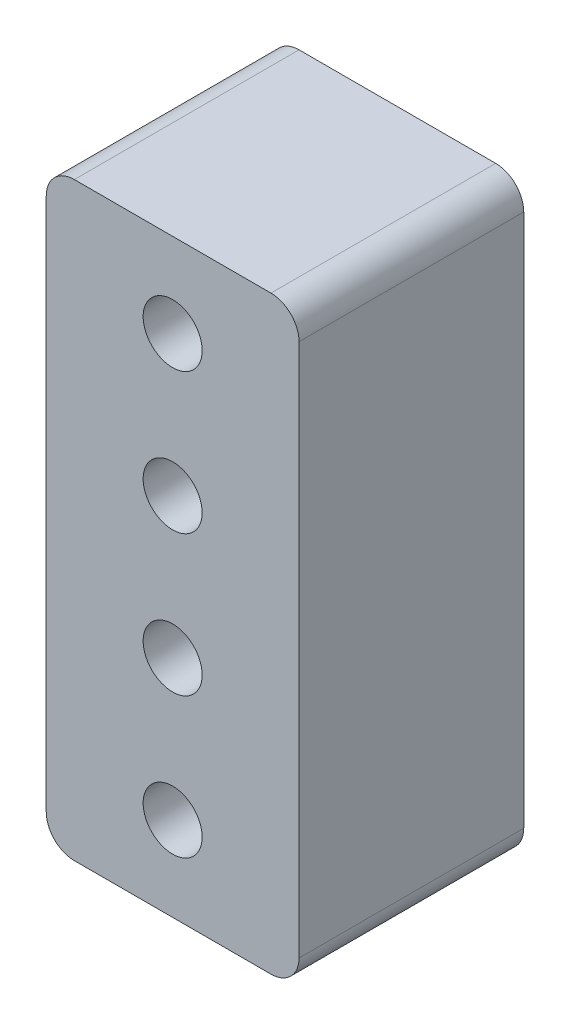
ISO-10303-21;
HEADER;
FILE_DESCRIPTION(('STEP AP214'),'2;1');
FILE_NAME('part.step','',(''),(''),'','','');
FILE_SCHEMA(('AUTOMOTIVE_DESIGN { 1 0 10303 214 1 1 1 1 }'));
ENDSEC;
DATA;
#1=APPLICATION_CONTEXT('core data for automotive mechanical design processes');
#2=APPLICATION_PROTOCOL_DEFINITION('international standard','automotive_design',2000,#1);
#3=PRODUCT_CONTEXT('',#1,'mechanical');
#4=PRODUCT('Part','Part','',(#3));
#5=PRODUCT_RELATED_PRODUCT_CATEGORY('part','',(#4));
#6=PRODUCT_DEFINITION_FORMATION('','',#4);
#7=PRODUCT_DEFINITION_CONTEXT('part definition',#1,'design');
#8=PRODUCT_DEFINITION('design','',#6,#7);
#9=PRODUCT_DEFINITION_SHAPE('','',#8);
#10=(LENGTH_UNIT() NAMED_UNIT(*) SI_UNIT(.MILLI.,.METRE.));
#11=(NAMED_UNIT(*) PLANE_ANGLE_UNIT() SI_UNIT($,.RADIAN.));
#12=(NAMED_UNIT(*) SI_UNIT($,.STERADIAN.) SOLID_ANGLE_UNIT());
#13=UNCERTAINTY_MEASURE_WITH_UNIT(LENGTH_MEASURE(1.E-05),#10,'distance_accuracy_value','');
#14=(GEOMETRIC_REPRESENTATION_CONTEXT(3) GLOBAL_UNCERTAINTY_ASSIGNED_CONTEXT((#13)) GLOBAL_UNIT_ASSIGNED_CONTEXT((#10,
#11,#12)) REPRESENTATION_CONTEXT('',''));
#15=CARTESIAN_POINT('',(0.,0.,0.));
#16=DIRECTION('',(0.,0.,1.));
#17=DIRECTION('',(1.,0.,0.));
#18=AXIS2_PLACEMENT_3D('',#15,#16,#17);
#19=CARTESIAN_POINT('',(22.5,15.,7.5));
#20=DIRECTION('',(0.,0.,1.));
#21=DIRECTION('',(1.,0.,0.));
#22=AXIS2_PLACEMENT_3D('',#19,#20,#21);
#23=CONICAL_SURFACE('',#22,2.5,0.18131977440149);
#24=CARTESIAN_POINT('',(22.5,15.,7.49999999999998));
#25=DIRECTION('',(0.,0.,-1.));
#26=DIRECTION('',(-1.,0.,0.));
#27=AXIS2_PLACEMENT_3D('',#24,#25,#26);
#28=CIRCLE('',#27,2.5);
#29=CARTESIAN_POINT('',(20.,15.,7.49999999999998));
#30=VERTEX_POINT('',#29);
#31=EDGE_CURVE('E301',#30,#30,#28,.F.);
#32=ORIENTED_EDGE('',*,*,#31,.F.);
#33=EDGE_LOOP('',(#32));
#34=FACE_BOUND('',#33,.T.);
#35=CARTESIAN_POINT('',(22.5,15.,22.5));
#36=DIRECTION('',(0.,0.,1.));
#37=DIRECTION('',(1.,0.,0.));
#38=AXIS2_PLACEMENT_3D('',#35,#36,#37);
#39=CIRCLE('',#38,5.25);
#40=CARTESIAN_POINT('',(27.75,15.,22.5));
#41=VERTEX_POINT('',#40);
#42=EDGE_CURVE('E238',#41,#41,#39,.T.);
#43=ORIENTED_EDGE('',*,*,#42,.T.);
#44=EDGE_LOOP('',(#43));
#45=FACE_BOUND('',#44,.T.);
#46=ADVANCED_FACE('F36',(#34,#45),#23,.F.);
#47=CARTESIAN_POINT('',(22.5,15.,7.5));
#48=DIRECTION('',(0.,-1.,0.));
#49=DIRECTION('',(-1.,0.,0.));
#50=AXIS2_PLACEMENT_3D('',#47,#48,#49);
#51=SPHERICAL_SURFACE('',#50,2.5);
#52=CARTESIAN_POINT('',(22.5,15.,7.5));
#53=DIRECTION('',(0.,0.,-1.));
#54=DIRECTION('',(-1.,0.,0.));
#55=AXIS2_PLACEMENT_3D('',#52,#53,#54);
#56=SPHERICAL_SURFACE('',#55,2.5);
#57=ORIENTED_EDGE('',*,*,#31,.T.);
#58=EDGE_LOOP('',(#57));
#59=FACE_BOUND('',#58,.T.);
#60=ADVANCED_FACE('F220',(#59),#56,.F.);
#61=CARTESIAN_POINT('',(22.5,15.,22.5));
#62=DIRECTION('',(0.,0.,1.));
#63=DIRECTION('',(1.,0.,0.));
#64=AXIS2_PLACEMENT_3D('',#61,#62,#63);
#65=CYLINDRICAL_SURFACE('',#64,5.25);
#66=ORIENTED_EDGE('',*,*,#42,.F.);
#67=EDGE_LOOP('',(#66));
#68=FACE_BOUND('',#67,.T.);
#69=CARTESIAN_POINT('',(22.5,15.,40.));
#70=DIRECTION('',(0.,0.,1.));
#71=DIRECTION('',(1.,0.,0.));
#72=AXIS2_PLACEMENT_3D('',#69,#70,#71);
#73=CIRCLE('',#72,5.25);
#74=CARTESIAN_POINT('',(27.75,15.,40.));
#75=VERTEX_POINT('',#74);
#76=EDGE_CURVE('E242',#75,#75,#73,.T.);
#77=ORIENTED_EDGE('',*,*,#76,.T.);
#78=EDGE_LOOP('',(#77));
#79=FACE_BOUND('',#78,.T.);
#80=ADVANCED_FACE('F215',(#68,#79),#65,.F.);
#81=CARTESIAN_POINT('',(22.5,40.,7.5));
#82=DIRECTION('',(0.,0.,1.));
#83=DIRECTION('',(1.,0.,0.));
#84=AXIS2_PLACEMENT_3D('',#81,#82,#83);
#85=CONICAL_SURFACE('',#84,2.5,0.18131977440149);
#86=CARTESIAN_POINT('',(22.5,40.,7.49999999999998));
#87=DIRECTION('',(0.,0.,-1.));
#88=DIRECTION('',(-1.,0.,0.));
#89=AXIS2_PLACEMENT_3D('',#86,#87,#88);
#90=CIRCLE('',#89,2.5);
#91=CARTESIAN_POINT('',(20.,40.,7.49999999999998));
#92=VERTEX_POINT('',#91);
#93=EDGE_CURVE('E306',#92,#92,#90,.F.);
#94=ORIENTED_EDGE('',*,*,#93,.F.);
#95=EDGE_LOOP('',(#94));
#96=FACE_BOUND('',#95,.T.);
#97=CARTESIAN_POINT('',(22.5,40.,22.5));
#98=DIRECTION('',(0.,0.,1.));
#99=DIRECTION('',(1.,0.,0.));
#100=AXIS2_PLACEMENT_3D('',#97,#98,#99);
#101=CIRCLE('',#100,5.25);
#102=CARTESIAN_POINT('',(27.75,40.,22.5));
#103=VERTEX_POINT('',#102);
#104=EDGE_CURVE('E200',#103,#103,#101,.T.);
#105=ORIENTED_EDGE('',*,*,#104,.T.);
#106=EDGE_LOOP('',(#105));
#107=FACE_BOUND('',#106,.T.);
#108=ADVANCED_FACE('F206',(#96,#107),#85,.F.);
#109=CARTESIAN_POINT('',(22.5,40.,7.5));
#110=DIRECTION('',(0.,-1.,0.));
#111=DIRECTION('',(-1.,0.,0.));
#112=AXIS2_PLACEMENT_3D('',#109,#110,#111);
#113=SPHERICAL_SURFACE('',#112,2.5);
#114=CARTESIAN_POINT('',(22.5,40.,7.5));
#115=DIRECTION('',(0.,0.,-1.));
#116=DIRECTION('',(-1.,0.,0.));
#117=AXIS2_PLACEMENT_3D('',#114,#115,#116);
#118=SPHERICAL_SURFACE('',#117,2.5);
#119=ORIENTED_EDGE('',*,*,#93,.T.);
#120=EDGE_LOOP('',(#119));
#121=FACE_BOUND('',#120,.T.);
#122=ADVANCED_FACE('F184',(#121),#118,.F.);
#123=CARTESIAN_POINT('',(22.5,40.,22.5));
#124=DIRECTION('',(0.,0.,1.));
#125=DIRECTION('',(1.,0.,0.));
#126=AXIS2_PLACEMENT_3D('',#123,#124,#125);
#127=CYLINDRICAL_SURFACE('',#126,5.25);
#128=ORIENTED_EDGE('',*,*,#104,.F.);
#129=EDGE_LOOP('',(#128));
#130=FACE_BOUND('',#129,.T.);
#131=CARTESIAN_POINT('',(22.5,40.,40.));
#132=DIRECTION('',(0.,0.,1.));
#133=DIRECTION('',(1.,0.,0.));
#134=AXIS2_PLACEMENT_3D('',#131,#132,#133);
#135=CIRCLE('',#134,5.25);
#136=CARTESIAN_POINT('',(27.75,40.,40.));
#137=VERTEX_POINT('',#136);
#138=EDGE_CURVE('E204',#137,#137,#135,.T.);
#139=ORIENTED_EDGE('',*,*,#138,.T.);
#140=EDGE_LOOP('',(#139));
#141=FACE_BOUND('',#140,.T.);
#142=ADVANCED_FACE('F179',(#130,#141),#127,.F.);
#143=CARTESIAN_POINT('',(0.,0.,40.));
#144=DIRECTION('',(1.,0.,0.));
#145=DIRECTION('',(0.,1.,0.));
#146=AXIS2_PLACEMENT_3D('',#143,#144,#145);
#147=PLANE('',#146);
#148=DIRECTION('',(0.,-1.,0.));
#149=VECTOR('',#148,1.);
#150=CARTESIAN_POINT('',(0.,0.,0.));
#151=LINE('',#150,#149);
#152=CARTESIAN_POINT('',(0.,100.,0.));
#153=VERTEX_POINT('',#152);
#154=CARTESIAN_POINT('',(0.,5.,0.));
#155=VERTEX_POINT('',#154);
#156=EDGE_CURVE('E133',#153,#155,#151,.T.);
#157=ORIENTED_EDGE('',*,*,#156,.T.);
#158=DIRECTION('',(0.,0.,-1.));
#159=VECTOR('',#158,1.);
#160=CARTESIAN_POINT('',(0.,5.,40.));
#161=LINE('',#160,#159);
#162=CARTESIAN_POINT('',(0.,5.,40.));
#163=VERTEX_POINT('',#162);
#164=EDGE_CURVE('E279',#155,#163,#161,.F.);
#165=ORIENTED_EDGE('',*,*,#164,.T.);
#166=DIRECTION('',(0.,-1.,0.));
#167=VECTOR('',#166,1.);
#168=CARTESIAN_POINT('',(0.,0.,40.));
#169=LINE('',#168,#167);
#170=CARTESIAN_POINT('',(0.,100.,40.));
#171=VERTEX_POINT('',#170);
#172=EDGE_CURVE('E131',#171,#163,#169,.T.);
#173=ORIENTED_EDGE('',*,*,#172,.F.);
#174=DIRECTION('',(0.,0.,-1.));
#175=VECTOR('',#174,1.);
#176=CARTESIAN_POINT('',(0.,100.,40.));
#177=LINE('',#176,#175);
#178=EDGE_CURVE('E276',#171,#153,#177,.T.);
#179=ORIENTED_EDGE('',*,*,#178,.T.);
#180=EDGE_LOOP('',(#157,#165,#173,#179));
#181=FACE_BOUND('',#180,.T.);
#182=ADVANCED_FACE('F175',(#181),#147,.F.);
#183=CARTESIAN_POINT('',(0.,0.,40.));
#184=DIRECTION('',(0.,1.,0.));
#185=DIRECTION('',(0.,0.,1.));
#186=AXIS2_PLACEMENT_3D('',#183,#184,#185);
#187=PLANE('',#186);
#188=DIRECTION('',(1.,0.,0.));
#189=VECTOR('',#188,1.);
#190=CARTESIAN_POINT('',(0.,0.,0.));
#191=LINE('',#190,#189);
#192=CARTESIAN_POINT('',(5.,0.,0.));
#193=VERTEX_POINT('',#192);
#194=CARTESIAN_POINT('',(40.,0.,0.));
#195=VERTEX_POINT('',#194);
#196=EDGE_CURVE('E129',#193,#195,#191,.T.);
#197=ORIENTED_EDGE('',*,*,#196,.T.);
#198=DIRECTION('',(0.,0.,-1.));
#199=VECTOR('',#198,1.);
#200=CARTESIAN_POINT('',(40.,0.,40.));
#201=LINE('',#200,#199);
#202=CARTESIAN_POINT('',(40.,0.,40.));
#203=VERTEX_POINT('',#202);
#204=EDGE_CURVE('E107',#195,#203,#201,.F.);
#205=ORIENTED_EDGE('',*,*,#204,.T.);
#206=DIRECTION('',(1.,0.,0.));
#207=VECTOR('',#206,1.);
#208=CARTESIAN_POINT('',(0.,0.,40.));
#209=LINE('',#208,#207);
#210=CARTESIAN_POINT('',(5.,0.,40.));
#211=VERTEX_POINT('',#210);
#212=EDGE_CURVE('E291',#211,#203,#209,.T.);
#213=ORIENTED_EDGE('',*,*,#212,.F.);
#214=DIRECTION('',(0.,0.,-1.));
#215=VECTOR('',#214,1.);
#216=CARTESIAN_POINT('',(5.,0.,40.));
#217=LINE('',#216,#215);
#218=EDGE_CURVE('E112',#211,#193,#217,.T.);
#219=ORIENTED_EDGE('',*,*,#218,.T.);
#220=EDGE_LOOP('',(#197,#205,#213,#219));
#221=FACE_BOUND('',#220,.T.);
#222=ADVANCED_FACE('F172',(#221),#187,.F.);
#223=CARTESIAN_POINT('',(45.,0.,40.));
#224=DIRECTION('',(-1.,0.,0.));
#225=DIRECTION('',(0.,-1.,0.));
#226=AXIS2_PLACEMENT_3D('',#223,#224,#225);
#227=PLANE('',#226);
#228=DIRECTION('',(0.,1.,0.));
#229=VECTOR('',#228,1.);
#230=CARTESIAN_POINT('',(45.,0.,40.));
#231=LINE('',#230,#229);
#232=CARTESIAN_POINT('',(45.,5.,40.));
#233=VERTEX_POINT('',#232);
#234=CARTESIAN_POINT('',(45.,100.,40.));
#235=VERTEX_POINT('',#234);
#236=EDGE_CURVE('E121',#233,#235,#231,.T.);
#237=ORIENTED_EDGE('',*,*,#236,.F.);
#238=DIRECTION('',(0.,0.,-1.));
#239=VECTOR('',#238,1.);
#240=CARTESIAN_POINT('',(45.,5.,40.));
#241=LINE('',#240,#239);
#242=CARTESIAN_POINT('',(45.,5.,0.));
#243=VERTEX_POINT('',#242);
#244=EDGE_CURVE('E106',#233,#243,#241,.T.);
#245=ORIENTED_EDGE('',*,*,#244,.T.);
#246=DIRECTION('',(0.,1.,0.));
#247=VECTOR('',#246,1.);
#248=CARTESIAN_POINT('',(45.,0.,0.));
#249=LINE('',#248,#247);
#250=CARTESIAN_POINT('',(45.,100.,0.));
#251=VERTEX_POINT('',#250);
#252=EDGE_CURVE('E119',#243,#251,#249,.T.);
#253=ORIENTED_EDGE('',*,*,#252,.T.);
#254=DIRECTION('',(0.,0.,-1.));
#255=VECTOR('',#254,1.);
#256=CARTESIAN_POINT('',(45.,100.,40.));
#257=LINE('',#256,#255);
#258=EDGE_CURVE('E123',#251,#235,#257,.F.);
#259=ORIENTED_EDGE('',*,*,#258,.T.);
#260=EDGE_LOOP('',(#237,#245,#253,#259));
#261=FACE_BOUND('',#260,.T.);
#262=ADVANCED_FACE('F118',(#261),#227,.F.);
#263=CARTESIAN_POINT('',(0.,105.,40.));
#264=DIRECTION('',(0.,-1.,0.));
#265=DIRECTION('',(0.,0.,-1.));
#266=AXIS2_PLACEMENT_3D('',#263,#264,#265);
#267=PLANE('',#266);
#268=DIRECTION('',(-1.,0.,0.));
#269=VECTOR('',#268,1.);
#270=CARTESIAN_POINT('',(0.,105.,40.));
#271=LINE('',#270,#269);
#272=CARTESIAN_POINT('',(40.,105.,40.));
#273=VERTEX_POINT('',#272);
#274=CARTESIAN_POINT('',(4.99999999999997,105.,40.));
#275=VERTEX_POINT('',#274);
#276=EDGE_CURVE('E315',#273,#275,#271,.T.);
#277=ORIENTED_EDGE('',*,*,#276,.F.);
#278=DIRECTION('',(0.,0.,-1.));
#279=VECTOR('',#278,1.);
#280=CARTESIAN_POINT('',(40.,105.,40.));
#281=LINE('',#280,#279);
#282=CARTESIAN_POINT('',(40.,105.,0.));
#283=VERTEX_POINT('',#282);
#284=EDGE_CURVE('E12',#273,#283,#281,.T.);
#285=ORIENTED_EDGE('',*,*,#284,.T.);
#286=DIRECTION('',(-1.,0.,0.));
#287=VECTOR('',#286,1.);
#288=CARTESIAN_POINT('',(0.,105.,0.));
#289=LINE('',#288,#287);
#290=CARTESIAN_POINT('',(4.99999999999997,105.,0.));
#291=VERTEX_POINT('',#290);
#292=EDGE_CURVE('E128',#283,#291,#289,.T.);
#293=ORIENTED_EDGE('',*,*,#292,.T.);
#294=DIRECTION('',(0.,0.,-1.));
#295=VECTOR('',#294,1.);
#296=CARTESIAN_POINT('',(4.99999999999997,105.,40.));
#297=LINE('',#296,#295);
#298=EDGE_CURVE('E44',#291,#275,#297,.F.);
#299=ORIENTED_EDGE('',*,*,#298,.T.);
#300=EDGE_LOOP('',(#277,#285,#293,#299));
#301=FACE_BOUND('',#300,.T.);
#302=ADVANCED_FACE('F164',(#301),#267,.F.);
#303=CARTESIAN_POINT('',(0.,0.,40.));
#304=DIRECTION('',(0.,0.,-1.));
#305=DIRECTION('',(-1.,0.,0.));
#306=AXIS2_PLACEMENT_3D('',#303,#304,#305);
#307=PLANE('',#306);
#308=CARTESIAN_POINT('',(22.5,65.,40.));
#309=DIRECTION('',(0.,0.,1.));
#310=DIRECTION('',(1.,0.,0.));
#311=AXIS2_PLACEMENT_3D('',#308,#309,#310);
#312=CIRCLE('',#311,5.25);
#313=CARTESIAN_POINT('',(27.75,65.,40.));
#314=VERTEX_POINT('',#313);
#315=EDGE_CURVE('E349',#314,#314,#312,.T.);
#316=ORIENTED_EDGE('',*,*,#315,.F.);
#317=EDGE_LOOP('',(#316));
#318=FACE_BOUND('',#317,.T.);
#319=CARTESIAN_POINT('',(22.5,90.,40.));
#320=DIRECTION('',(0.,0.,1.));
#321=DIRECTION('',(1.,0.,0.));
#322=AXIS2_PLACEMENT_3D('',#319,#320,#321);
#323=CIRCLE('',#322,5.25);
#324=CARTESIAN_POINT('',(27.75,90.,40.));
#325=VERTEX_POINT('',#324);
#326=EDGE_CURVE('E321',#325,#325,#323,.T.);
#327=ORIENTED_EDGE('',*,*,#326,.F.);
#328=EDGE_LOOP('',(#327));
#329=FACE_BOUND('',#328,.T.);
#330=ORIENTED_EDGE('',*,*,#212,.T.);
#331=CARTESIAN_POINT('',(40.,5.,40.));
#332=DIRECTION('',(0.,0.,-1.));
#333=DIRECTION('',(-1.,0.,0.));
#334=AXIS2_PLACEMENT_3D('',#331,#332,#333);
#335=CIRCLE('',#334,5.);
#336=EDGE_CURVE('E270',#203,#233,#335,.F.);
#337=ORIENTED_EDGE('',*,*,#336,.T.);
#338=ORIENTED_EDGE('',*,*,#236,.T.);
#339=CARTESIAN_POINT('',(40.,100.,40.));
#340=DIRECTION('',(0.,0.,-1.));
#341=DIRECTION('',(-1.,0.,0.));
#342=AXIS2_PLACEMENT_3D('',#339,#340,#341);
#343=CIRCLE('',#342,5.);
#344=EDGE_CURVE('E57',#235,#273,#343,.F.);
#345=ORIENTED_EDGE('',*,*,#344,.T.);
#346=ORIENTED_EDGE('',*,*,#276,.T.);
#347=CARTESIAN_POINT('',(4.99999999999997,100.,40.));
#348=DIRECTION('',(0.,0.,-1.));
#349=DIRECTION('',(-1.,0.,0.));
#350=AXIS2_PLACEMENT_3D('',#347,#348,#349);
#351=CIRCLE('',#350,5.);
#352=EDGE_CURVE('E268',#275,#171,#351,.F.);
#353=ORIENTED_EDGE('',*,*,#352,.T.);
#354=ORIENTED_EDGE('',*,*,#172,.T.);
#355=CARTESIAN_POINT('',(5.,5.,40.));
#356=DIRECTION('',(0.,0.,-1.));
#357=DIRECTION('',(-1.,0.,0.));
#358=AXIS2_PLACEMENT_3D('',#355,#356,#357);
#359=CIRCLE('',#358,5.);
#360=EDGE_CURVE('E267',#163,#211,#359,.F.);
#361=ORIENTED_EDGE('',*,*,#360,.T.);
#362=EDGE_LOOP('',(#330,#337,#338,#345,#346,#353,#354,#361));
#363=FACE_BOUND('',#362,.T.);
#364=ORIENTED_EDGE('',*,*,#138,.F.);
#365=EDGE_LOOP('',(#364));
#366=FACE_BOUND('',#365,.T.);
#367=ORIENTED_EDGE('',*,*,#76,.F.);
#368=EDGE_LOOP('',(#367));
#369=FACE_BOUND('',#368,.T.);
#370=ADVANCED_FACE('F161',(#318,#329,#363,#366,#369),#307,.F.);
#371=CARTESIAN_POINT('',(0.,0.,0.));
#372=DIRECTION('',(0.,0.,-1.));
#373=DIRECTION('',(-1.,0.,0.));
#374=AXIS2_PLACEMENT_3D('',#371,#372,#373);
#375=PLANE('',#374);
#376=ORIENTED_EDGE('',*,*,#252,.F.);
#377=CARTESIAN_POINT('',(40.,5.,0.));
#378=DIRECTION('',(0.,0.,-1.));
#379=DIRECTION('',(-1.,0.,0.));
#380=AXIS2_PLACEMENT_3D('',#377,#378,#379);
#381=CIRCLE('',#380,5.);
#382=EDGE_CURVE('E102',#243,#195,#381,.T.);
#383=ORIENTED_EDGE('',*,*,#382,.T.);
#384=ORIENTED_EDGE('',*,*,#196,.F.);
#385=CARTESIAN_POINT('',(5.,5.,0.));
#386=DIRECTION('',(0.,0.,-1.));
#387=DIRECTION('',(-1.,0.,0.));
#388=AXIS2_PLACEMENT_3D('',#385,#386,#387);
#389=CIRCLE('',#388,5.);
#390=EDGE_CURVE('E113',#193,#155,#389,.T.);
#391=ORIENTED_EDGE('',*,*,#390,.T.);
#392=ORIENTED_EDGE('',*,*,#156,.F.);
#393=CARTESIAN_POINT('',(4.99999999999997,100.,0.));
#394=DIRECTION('',(0.,0.,-1.));
#395=DIRECTION('',(-1.,0.,0.));
#396=AXIS2_PLACEMENT_3D('',#393,#394,#395);
#397=CIRCLE('',#396,5.);
#398=EDGE_CURVE('E122',#153,#291,#397,.T.);
#399=ORIENTED_EDGE('',*,*,#398,.T.);
#400=ORIENTED_EDGE('',*,*,#292,.F.);
#401=CARTESIAN_POINT('',(40.,100.,0.));
#402=DIRECTION('',(0.,0.,-1.));
#403=DIRECTION('',(-1.,0.,0.));
#404=AXIS2_PLACEMENT_3D('',#401,#402,#403);
#405=CIRCLE('',#404,5.);
#406=EDGE_CURVE('E127',#283,#251,#405,.T.);
#407=ORIENTED_EDGE('',*,*,#406,.T.);
#408=EDGE_LOOP('',(#376,#383,#384,#391,#392,#399,#400,#407));
#409=FACE_BOUND('',#408,.T.);
#410=ADVANCED_FACE('F125',(#409),#375,.T.);
#411=CARTESIAN_POINT('',(22.5,90.,22.5));
#412=DIRECTION('',(0.,0.,1.));
#413=DIRECTION('',(1.,0.,0.));
#414=AXIS2_PLACEMENT_3D('',#411,#412,#413);
#415=CYLINDRICAL_SURFACE('',#414,5.25);
#416=CARTESIAN_POINT('',(22.5,90.,22.5));
#417=DIRECTION('',(0.,0.,1.));
#418=DIRECTION('',(1.,0.,0.));
#419=AXIS2_PLACEMENT_3D('',#416,#417,#418);
#420=CIRCLE('',#419,5.25);
#421=CARTESIAN_POINT('',(27.75,90.,22.5));
#422=VERTEX_POINT('',#421);
#423=EDGE_CURVE('E141',#422,#422,#420,.T.);
#424=ORIENTED_EDGE('',*,*,#423,.F.);
#425=EDGE_LOOP('',(#424));
#426=FACE_BOUND('',#425,.T.);
#427=ORIENTED_EDGE('',*,*,#326,.T.);
#428=EDGE_LOOP('',(#427));
#429=FACE_BOUND('',#428,.T.);
#430=ADVANCED_FACE('F148',(#426,#429),#415,.F.);
#431=CARTESIAN_POINT('',(22.5,90.,7.5));
#432=DIRECTION('',(0.,0.,1.));
#433=DIRECTION('',(1.,0.,0.));
#434=AXIS2_PLACEMENT_3D('',#431,#432,#433);
#435=CONICAL_SURFACE('',#434,2.5,0.18131977440149);
#436=CARTESIAN_POINT('',(22.5,90.,7.49999999999998));
#437=DIRECTION('',(0.,0.,-1.));
#438=DIRECTION('',(-1.,0.,0.));
#439=AXIS2_PLACEMENT_3D('',#436,#437,#438);
#440=CIRCLE('',#439,2.5);
#441=CARTESIAN_POINT('',(20.,90.,7.49999999999998));
#442=VERTEX_POINT('',#441);
#443=EDGE_CURVE('E326',#442,#442,#440,.F.);
#444=ORIENTED_EDGE('',*,*,#443,.F.);
#445=EDGE_LOOP('',(#444));
#446=FACE_BOUND('',#445,.T.);
#447=ORIENTED_EDGE('',*,*,#423,.T.);
#448=EDGE_LOOP('',(#447));
#449=FACE_BOUND('',#448,.T.);
#450=ADVANCED_FACE('F158',(#446,#449),#435,.F.);
#451=CARTESIAN_POINT('',(22.5,90.,7.5));
#452=DIRECTION('',(0.,-1.,0.));
#453=DIRECTION('',(-1.,0.,0.));
#454=AXIS2_PLACEMENT_3D('',#451,#452,#453);
#455=SPHERICAL_SURFACE('',#454,2.5);
#456=CARTESIAN_POINT('',(22.5,90.,7.5));
#457=DIRECTION('',(0.,0.,-1.));
#458=DIRECTION('',(-1.,0.,0.));
#459=AXIS2_PLACEMENT_3D('',#456,#457,#458);
#460=SPHERICAL_SURFACE('',#459,2.5);
#461=ORIENTED_EDGE('',*,*,#443,.T.);
#462=EDGE_LOOP('',(#461));
#463=FACE_BOUND('',#462,.T.);
#464=ADVANCED_FACE('F368',(#463),#460,.F.);
#465=CARTESIAN_POINT('',(22.5,65.,22.5));
#466=DIRECTION('',(0.,0.,1.));
#467=DIRECTION('',(1.,0.,0.));
#468=AXIS2_PLACEMENT_3D('',#465,#466,#467);
#469=CYLINDRICAL_SURFACE('',#468,5.25);
#470=CARTESIAN_POINT('',(22.5,65.,22.5));
#471=DIRECTION('',(0.,0.,1.));
#472=DIRECTION('',(1.,0.,0.));
#473=AXIS2_PLACEMENT_3D('',#470,#471,#472);
#474=CIRCLE('',#473,5.25);
#475=CARTESIAN_POINT('',(27.75,65.,22.5));
#476=VERTEX_POINT('',#475);
#477=EDGE_CURVE('E341',#476,#476,#474,.T.);
#478=ORIENTED_EDGE('',*,*,#477,.F.);
#479=EDGE_LOOP('',(#478));
#480=FACE_BOUND('',#479,.T.);
#481=ORIENTED_EDGE('',*,*,#315,.T.);
#482=EDGE_LOOP('',(#481));
#483=FACE_BOUND('',#482,.T.);
#484=ADVANCED_FACE('F358',(#480,#483),#469,.F.);
#485=CARTESIAN_POINT('',(22.5,65.,7.5));
#486=DIRECTION('',(0.,-1.,0.));
#487=DIRECTION('',(-1.,0.,0.));
#488=AXIS2_PLACEMENT_3D('',#485,#486,#487);
#489=SPHERICAL_SURFACE('',#488,2.5);
#490=CARTESIAN_POINT('',(22.5,65.,7.5));
#491=DIRECTION('',(0.,0.,-1.));
#492=DIRECTION('',(-1.,0.,0.));
#493=AXIS2_PLACEMENT_3D('',#490,#491,#492);
#494=SPHERICAL_SURFACE('',#493,2.5);
#495=CARTESIAN_POINT('',(22.5,65.,7.49999999999998));
#496=DIRECTION('',(0.,0.,-1.));
#497=DIRECTION('',(-1.,0.,0.));
#498=AXIS2_PLACEMENT_3D('',#495,#496,#497);
#499=CIRCLE('',#498,2.5);
#500=CARTESIAN_POINT('',(20.,65.,7.49999999999998));
#501=VERTEX_POINT('',#500);
#502=EDGE_CURVE('E346',#501,#501,#499,.F.);
#503=ORIENTED_EDGE('',*,*,#502,.T.);
#504=EDGE_LOOP('',(#503));
#505=FACE_BOUND('',#504,.T.);
#506=ADVANCED_FACE('F367',(#505),#494,.F.);
#507=CARTESIAN_POINT('',(22.5,65.,7.5));
#508=DIRECTION('',(0.,0.,1.));
#509=DIRECTION('',(1.,0.,0.));
#510=AXIS2_PLACEMENT_3D('',#507,#508,#509);
#511=CONICAL_SURFACE('',#510,2.5,0.18131977440149);
#512=ORIENTED_EDGE('',*,*,#502,.F.);
#513=EDGE_LOOP('',(#512));
#514=FACE_BOUND('',#513,.T.);
#515=ORIENTED_EDGE('',*,*,#477,.T.);
#516=EDGE_LOOP('',(#515));
#517=FACE_BOUND('',#516,.T.);
#518=ADVANCED_FACE('F256',(#514,#517),#511,.F.);
#519=CARTESIAN_POINT('',(40.,5.,40.));
#520=DIRECTION('',(0.,0.,-1.));
#521=DIRECTION('',(-1.,0.,0.));
#522=AXIS2_PLACEMENT_3D('',#519,#520,#521);
#523=CYLINDRICAL_SURFACE('',#522,5.);
#524=ORIENTED_EDGE('',*,*,#336,.F.);
#525=ORIENTED_EDGE('',*,*,#204,.F.);
#526=ORIENTED_EDGE('',*,*,#382,.F.);
#527=ORIENTED_EDGE('',*,*,#244,.F.);
#528=EDGE_LOOP('',(#524,#525,#526,#527));
#529=FACE_BOUND('',#528,.T.);
#530=ADVANCED_FACE('F105',(#529),#523,.T.);
#531=CARTESIAN_POINT('',(5.,5.,40.));
#532=DIRECTION('',(0.,0.,-1.));
#533=DIRECTION('',(-1.,0.,0.));
#534=AXIS2_PLACEMENT_3D('',#531,#532,#533);
#535=CYLINDRICAL_SURFACE('',#534,5.);
#536=ORIENTED_EDGE('',*,*,#360,.F.);
#537=ORIENTED_EDGE('',*,*,#164,.F.);
#538=ORIENTED_EDGE('',*,*,#390,.F.);
#539=ORIENTED_EDGE('',*,*,#218,.F.);
#540=EDGE_LOOP('',(#536,#537,#538,#539));
#541=FACE_BOUND('',#540,.T.);
#542=ADVANCED_FACE('F255',(#541),#535,.T.);
#543=CARTESIAN_POINT('',(40.,100.,40.));
#544=DIRECTION('',(0.,0.,-1.));
#545=DIRECTION('',(-1.,0.,0.));
#546=AXIS2_PLACEMENT_3D('',#543,#544,#545);
#547=CYLINDRICAL_SURFACE('',#546,5.);
#548=ORIENTED_EDGE('',*,*,#344,.F.);
#549=ORIENTED_EDGE('',*,*,#258,.F.);
#550=ORIENTED_EDGE('',*,*,#406,.F.);
#551=ORIENTED_EDGE('',*,*,#284,.F.);
#552=EDGE_LOOP('',(#548,#549,#550,#551));
#553=FACE_BOUND('',#552,.T.);
#554=ADVANCED_FACE('F258',(#553),#547,.T.);
#555=CARTESIAN_POINT('',(4.99999999999997,100.,40.));
#556=DIRECTION('',(0.,0.,-1.));
#557=DIRECTION('',(-1.,0.,0.));
#558=AXIS2_PLACEMENT_3D('',#555,#556,#557);
#559=CYLINDRICAL_SURFACE('',#558,5.);
#560=ORIENTED_EDGE('',*,*,#352,.F.);
#561=ORIENTED_EDGE('',*,*,#298,.F.);
#562=ORIENTED_EDGE('',*,*,#398,.F.);
#563=ORIENTED_EDGE('',*,*,#178,.F.);
#564=EDGE_LOOP('',(#560,#561,#562,#563));
#565=FACE_BOUND('',#564,.T.);
#566=ADVANCED_FACE('F38',(#565),#559,.T.);
#567=CLOSED_SHELL('',(#46,#60,#80,#108,#122,#142,#182,#222,#262,#302,#370,#410,#430,#450,#464,
#484,#506,#518,#530,#542,#554,#566));
#568=MANIFOLD_SOLID_BREP('B2',#567);
#569=ADVANCED_BREP_SHAPE_REPRESENTATION('',(#18,#568),#14);
#570=SHAPE_DEFINITION_REPRESENTATION(#9,#569);
ENDSEC;
END-ISO-10303-21;
